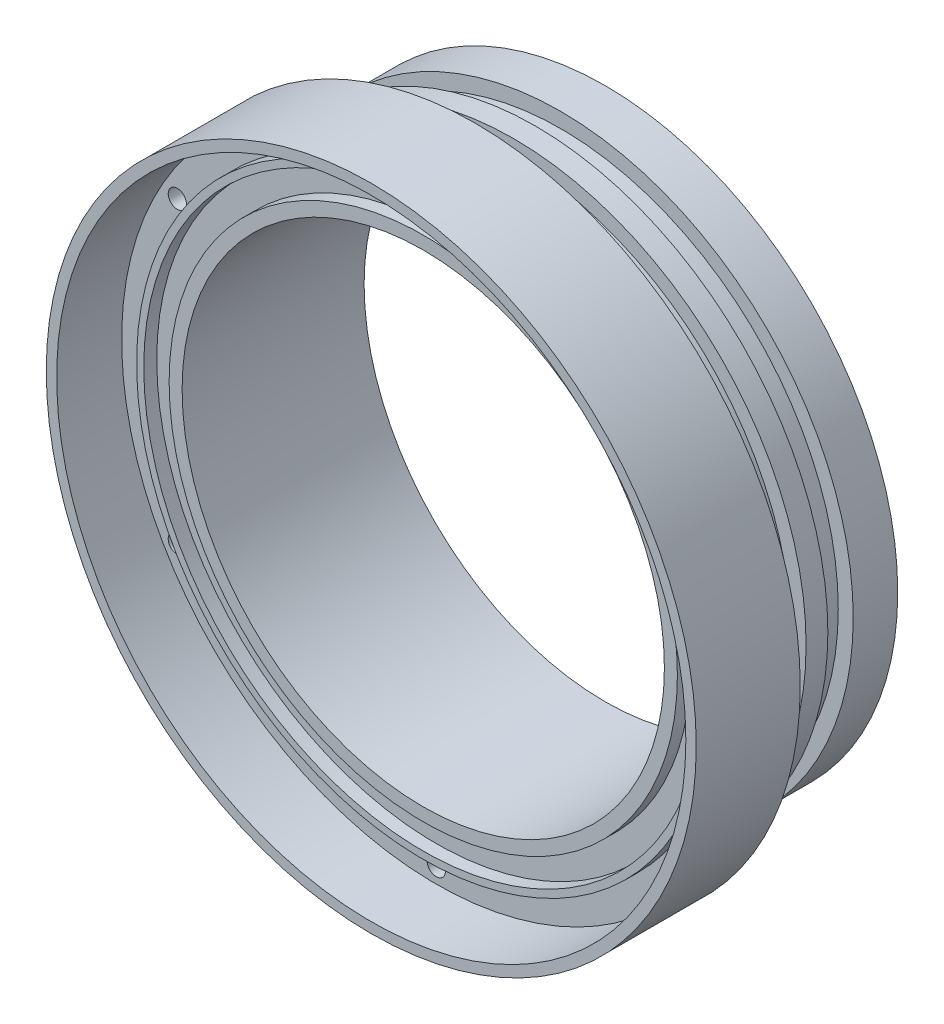
ISO-10303-21;
HEADER;
FILE_DESCRIPTION(('STEP AP214'),'2;1');
FILE_NAME('part.step','',(''),(''),'','','');
FILE_SCHEMA(('AUTOMOTIVE_DESIGN { 1 0 10303 214 1 1 1 1 }'));
ENDSEC;
DATA;
#1=APPLICATION_CONTEXT('core data for automotive mechanical design processes');
#2=APPLICATION_PROTOCOL_DEFINITION('international standard','automotive_design',2000,#1);
#3=PRODUCT_CONTEXT('',#1,'mechanical');
#4=PRODUCT('Part','Part','',(#3));
#5=PRODUCT_RELATED_PRODUCT_CATEGORY('part','',(#4));
#6=PRODUCT_DEFINITION_FORMATION('','',#4);
#7=PRODUCT_DEFINITION_CONTEXT('part definition',#1,'design');
#8=PRODUCT_DEFINITION('design','',#6,#7);
#9=PRODUCT_DEFINITION_SHAPE('','',#8);
#10=(LENGTH_UNIT() NAMED_UNIT(*) SI_UNIT(.MILLI.,.METRE.));
#11=(NAMED_UNIT(*) PLANE_ANGLE_UNIT() SI_UNIT($,.RADIAN.));
#12=(NAMED_UNIT(*) SI_UNIT($,.STERADIAN.) SOLID_ANGLE_UNIT());
#13=UNCERTAINTY_MEASURE_WITH_UNIT(LENGTH_MEASURE(1.E-05),#10,'distance_accuracy_value','');
#14=(GEOMETRIC_REPRESENTATION_CONTEXT(3) GLOBAL_UNCERTAINTY_ASSIGNED_CONTEXT((#13)) GLOBAL_UNIT_ASSIGNED_CONTEXT((#10,
#11,#12)) REPRESENTATION_CONTEXT('',''));
#15=CARTESIAN_POINT('',(0.,0.,0.));
#16=DIRECTION('',(0.,0.,1.));
#17=DIRECTION('',(1.,0.,0.));
#18=AXIS2_PLACEMENT_3D('',#15,#16,#17);
#19=CARTESIAN_POINT('',(0.,0.,-8.));
#20=DIRECTION('',(0.,0.,-1.));
#21=DIRECTION('',(-1.,0.,0.));
#22=AXIS2_PLACEMENT_3D('',#19,#20,#21);
#23=CYLINDRICAL_SURFACE('',#22,45.);
#24=CARTESIAN_POINT('',(0.,0.,-8.));
#25=DIRECTION('',(0.,0.,-1.));
#26=DIRECTION('',(-1.,0.,0.));
#27=AXIS2_PLACEMENT_3D('',#24,#25,#26);
#28=CIRCLE('',#27,45.);
#29=CARTESIAN_POINT('',(-45.,0.,-8.));
#30=VERTEX_POINT('',#29);
#31=EDGE_CURVE('E77',#30,#30,#28,.T.);
#32=ORIENTED_EDGE('',*,*,#31,.T.);
#33=EDGE_LOOP('',(#32));
#34=FACE_BOUND('',#33,.T.);
#35=CARTESIAN_POINT('',(0.,0.,-10.));
#36=DIRECTION('',(0.,0.,1.));
#37=DIRECTION('',(1.,0.,0.));
#38=AXIS2_PLACEMENT_3D('',#35,#36,#37);
#39=CIRCLE('',#38,45.);
#40=CARTESIAN_POINT('',(45.,0.,-10.));
#41=VERTEX_POINT('',#40);
#42=EDGE_CURVE('E156',#41,#41,#39,.T.);
#43=ORIENTED_EDGE('',*,*,#42,.T.);
#44=EDGE_LOOP('',(#43));
#45=FACE_BOUND('',#44,.T.);
#46=ADVANCED_FACE('F69',(#34,#45),#23,.T.);
#47=CARTESIAN_POINT('',(0.,0.,0.));
#48=DIRECTION('',(0.,0.,1.));
#49=DIRECTION('',(1.,0.,0.));
#50=AXIS2_PLACEMENT_3D('',#47,#48,#49);
#51=PLANE('',#50);
#52=CARTESIAN_POINT('',(0.,0.,0.));
#53=DIRECTION('',(0.,0.,1.));
#54=DIRECTION('',(1.,0.,0.));
#55=AXIS2_PLACEMENT_3D('',#52,#53,#54);
#56=CIRCLE('',#55,43.);
#57=CARTESIAN_POINT('',(43.,0.,0.));
#58=VERTEX_POINT('',#57);
#59=EDGE_CURVE('E93',#58,#58,#56,.T.);
#60=ORIENTED_EDGE('',*,*,#59,.F.);
#61=EDGE_LOOP('',(#60));
#62=FACE_BOUND('',#61,.T.);
#63=CARTESIAN_POINT('',(0.,0.,0.));
#64=DIRECTION('',(0.,0.,1.));
#65=DIRECTION('',(1.,0.,0.));
#66=AXIS2_PLACEMENT_3D('',#63,#64,#65);
#67=CIRCLE('',#66,44.1);
#68=CARTESIAN_POINT('',(44.1,0.,0.));
#69=VERTEX_POINT('',#68);
#70=EDGE_CURVE('E143',#69,#69,#67,.T.);
#71=ORIENTED_EDGE('',*,*,#70,.T.);
#72=EDGE_LOOP('',(#71));
#73=FACE_BOUND('',#72,.T.);
#74=ADVANCED_FACE('F239',(#62,#73),#51,.T.);
#75=CARTESIAN_POINT('',(0.,0.,0.));
#76=DIRECTION('',(0.,0.,1.));
#77=DIRECTION('',(1.,0.,0.));
#78=AXIS2_PLACEMENT_3D('',#75,#76,#77);
#79=CIRCLE('',#78,37.1);
#80=CARTESIAN_POINT('',(37.1,0.,0.));
#81=VERTEX_POINT('',#80);
#82=EDGE_CURVE('E85',#81,#81,#79,.T.);
#83=ORIENTED_EDGE('',*,*,#82,.F.);
#84=EDGE_LOOP('',(#83));
#85=FACE_BOUND('',#84,.T.);
#86=CARTESIAN_POINT('',(0.,0.,0.));
#87=DIRECTION('',(0.,0.,1.));
#88=DIRECTION('',(1.,0.,0.));
#89=AXIS2_PLACEMENT_3D('',#86,#87,#88);
#90=CIRCLE('',#89,39.1);
#91=CARTESIAN_POINT('',(39.1,0.,0.));
#92=VERTEX_POINT('',#91);
#93=EDGE_CURVE('E97',#92,#92,#90,.T.);
#94=ORIENTED_EDGE('',*,*,#93,.T.);
#95=EDGE_LOOP('',(#94));
#96=FACE_BOUND('',#95,.T.);
#97=ADVANCED_FACE('F351',(#85,#96),#51,.T.);
#98=CARTESIAN_POINT('',(0.,0.,-28.));
#99=DIRECTION('',(0.,0.,1.));
#100=DIRECTION('',(1.,0.,0.));
#101=AXIS2_PLACEMENT_3D('',#98,#99,#100);
#102=CYLINDRICAL_SURFACE('',#101,50.);
#103=CARTESIAN_POINT('',(0.,0.,-8.));
#104=DIRECTION('',(0.,0.,-1.));
#105=DIRECTION('',(-1.,0.,0.));
#106=AXIS2_PLACEMENT_3D('',#103,#104,#105);
#107=CIRCLE('',#106,50.);
#108=CARTESIAN_POINT('',(-50.,0.,-8.));
#109=VERTEX_POINT('',#108);
#110=EDGE_CURVE('E11',#109,#109,#107,.F.);
#111=ORIENTED_EDGE('',*,*,#110,.T.);
#112=EDGE_LOOP('',(#111));
#113=FACE_BOUND('',#112,.T.);
#114=CARTESIAN_POINT('',(0.,0.,8.));
#115=DIRECTION('',(0.,0.,1.));
#116=DIRECTION('',(1.,0.,0.));
#117=AXIS2_PLACEMENT_3D('',#114,#115,#116);
#118=CIRCLE('',#117,50.);
#119=CARTESIAN_POINT('',(50.,0.,8.));
#120=VERTEX_POINT('',#119);
#121=EDGE_CURVE('E120',#120,#120,#118,.T.);
#122=ORIENTED_EDGE('',*,*,#121,.F.);
#123=EDGE_LOOP('',(#122));
#124=FACE_BOUND('',#123,.T.);
#125=ADVANCED_FACE('F71',(#113,#124),#102,.T.);
#126=CARTESIAN_POINT('',(0.,0.,-8.));
#127=DIRECTION('',(0.,0.,-1.));
#128=DIRECTION('',(-1.,0.,0.));
#129=AXIS2_PLACEMENT_3D('',#126,#127,#128);
#130=PLANE('',#129);
#131=ORIENTED_EDGE('',*,*,#110,.F.);
#132=EDGE_LOOP('',(#131));
#133=FACE_BOUND('',#132,.T.);
#134=ORIENTED_EDGE('',*,*,#31,.F.);
#135=EDGE_LOOP('',(#134));
#136=FACE_BOUND('',#135,.T.);
#137=ADVANCED_FACE('F227',(#133,#136),#130,.T.);
#138=CARTESIAN_POINT('',(0.,0.,-21.1513502806122));
#139=DIRECTION('',(0.,0.,1.));
#140=DIRECTION('',(1.,0.,0.));
#141=AXIS2_PLACEMENT_3D('',#138,#139,#140);
#142=CIRCLE('',#141,45.);
#143=CARTESIAN_POINT('',(45.,0.,-21.1513502806122));
#144=VERTEX_POINT('',#143);
#145=EDGE_CURVE('E160',#144,#144,#142,.T.);
#146=ORIENTED_EDGE('',*,*,#145,.F.);
#147=EDGE_LOOP('',(#146));
#148=FACE_BOUND('',#147,.T.);
#149=CARTESIAN_POINT('',(0.,0.,-28.));
#150=DIRECTION('',(0.,0.,-1.));
#151=DIRECTION('',(-1.,0.,0.));
#152=AXIS2_PLACEMENT_3D('',#149,#150,#151);
#153=CIRCLE('',#152,45.);
#154=CARTESIAN_POINT('',(-45.,0.,-28.));
#155=VERTEX_POINT('',#154);
#156=EDGE_CURVE('E81',#155,#155,#153,.T.);
#157=ORIENTED_EDGE('',*,*,#156,.F.);
#158=EDGE_LOOP('',(#157));
#159=FACE_BOUND('',#158,.T.);
#160=ADVANCED_FACE('F214',(#148,#159),#23,.T.);
#161=CARTESIAN_POINT('',(0.,0.,-28.));
#162=DIRECTION('',(0.,0.,1.));
#163=DIRECTION('',(1.,0.,0.));
#164=AXIS2_PLACEMENT_3D('',#161,#162,#163);
#165=PLANE('',#164);
#166=CARTESIAN_POINT('',(0.,40.8747226668168,-28.));
#167=DIRECTION('',(0.,0.,-1.));
#168=DIRECTION('',(-1.,0.,0.));
#169=AXIS2_PLACEMENT_3D('',#166,#167,#168);
#170=CIRCLE('',#169,1.35630320483185);
#171=CARTESIAN_POINT('',(-1.35630320483185,40.8747226668168,-28.));
#172=VERTEX_POINT('',#171);
#173=EDGE_CURVE('E195',#172,#172,#170,.T.);
#174=ORIENTED_EDGE('',*,*,#173,.F.);
#175=EDGE_LOOP('',(#174));
#176=FACE_BOUND('',#175,.T.);
#177=CARTESIAN_POINT('',(-40.8747226668179,1.15672378085662E-12,-28.));
#178=DIRECTION('',(0.,0.,-1.));
#179=DIRECTION('',(-1.,0.,0.));
#180=AXIS2_PLACEMENT_3D('',#177,#178,#179);
#181=CIRCLE('',#180,1.35630320483275);
#182=CARTESIAN_POINT('',(-42.2310258716507,1.15672378085662E-12,-28.));
#183=VERTEX_POINT('',#182);
#184=EDGE_CURVE('E189',#183,#183,#181,.T.);
#185=ORIENTED_EDGE('',*,*,#184,.F.);
#186=EDGE_LOOP('',(#185));
#187=FACE_BOUND('',#186,.T.);
#188=CARTESIAN_POINT('',(-2.31344756171324E-12,-40.8747226668168,-28.));
#189=DIRECTION('',(0.,0.,-1.));
#190=DIRECTION('',(-1.,0.,0.));
#191=AXIS2_PLACEMENT_3D('',#188,#189,#190);
#192=CIRCLE('',#191,1.35630320483434);
#193=CARTESIAN_POINT('',(-1.35630320483665,-40.8747226668168,-28.));
#194=VERTEX_POINT('',#193);
#195=EDGE_CURVE('E183',#194,#194,#192,.T.);
#196=ORIENTED_EDGE('',*,*,#195,.F.);
#197=EDGE_LOOP('',(#196));
#198=FACE_BOUND('',#197,.T.);
#199=CARTESIAN_POINT('',(40.8747226668156,-1.16172949068461E-12,-28.));
#200=DIRECTION('',(0.,0.,-1.));
#201=DIRECTION('',(-1.,0.,0.));
#202=AXIS2_PLACEMENT_3D('',#199,#200,#201);
#203=CIRCLE('',#202,1.35630320483371);
#204=CARTESIAN_POINT('',(39.5184194619819,-1.16172949068461E-12,-28.));
#205=VERTEX_POINT('',#204);
#206=EDGE_CURVE('E177',#205,#205,#203,.T.);
#207=ORIENTED_EDGE('',*,*,#206,.F.);
#208=EDGE_LOOP('',(#207));
#209=FACE_BOUND('',#208,.T.);
#210=CARTESIAN_POINT('',(0.,0.,-28.));
#211=DIRECTION('',(0.,0.,-1.));
#212=DIRECTION('',(-1.,0.,0.));
#213=AXIS2_PLACEMENT_3D('',#210,#211,#212);
#214=CIRCLE('',#213,37.1);
#215=CARTESIAN_POINT('',(-37.1,0.,-28.));
#216=VERTEX_POINT('',#215);
#217=EDGE_CURVE('E89',#216,#216,#214,.T.);
#218=ORIENTED_EDGE('',*,*,#217,.F.);
#219=EDGE_LOOP('',(#218));
#220=FACE_BOUND('',#219,.T.);
#221=ORIENTED_EDGE('',*,*,#156,.T.);
#222=EDGE_LOOP('',(#221));
#223=FACE_BOUND('',#222,.T.);
#224=ADVANCED_FACE('F210',(#176,#187,#198,#209,#220,#223),#165,.F.);
#225=CARTESIAN_POINT('',(0.,0.,18.3831416051891));
#226=DIRECTION('',(0.,0.,-1.));
#227=DIRECTION('',(-1.,0.,0.));
#228=AXIS2_PLACEMENT_3D('',#225,#226,#227);
#229=CYLINDRICAL_SURFACE('',#228,37.1);
#230=ORIENTED_EDGE('',*,*,#82,.T.);
#231=EDGE_LOOP('',(#230));
#232=FACE_BOUND('',#231,.T.);
#233=ORIENTED_EDGE('',*,*,#217,.T.);
#234=EDGE_LOOP('',(#233));
#235=FACE_BOUND('',#234,.T.);
#236=ADVANCED_FACE('F213',(#232,#235),#229,.F.);
#237=CARTESIAN_POINT('',(0.,0.,-2.));
#238=DIRECTION('',(0.,0.,1.));
#239=DIRECTION('',(1.,0.,0.));
#240=AXIS2_PLACEMENT_3D('',#237,#238,#239);
#241=CYLINDRICAL_SURFACE('',#240,39.1);
#242=CARTESIAN_POINT('',(0.,0.,-2.));
#243=DIRECTION('',(0.,0.,1.));
#244=DIRECTION('',(1.,0.,0.));
#245=AXIS2_PLACEMENT_3D('',#242,#243,#244);
#246=CIRCLE('',#245,39.1);
#247=CARTESIAN_POINT('',(39.1,0.,-2.));
#248=VERTEX_POINT('',#247);
#249=EDGE_CURVE('E96',#248,#248,#246,.T.);
#250=ORIENTED_EDGE('',*,*,#249,.T.);
#251=EDGE_LOOP('',(#250));
#252=FACE_BOUND('',#251,.T.);
#253=ORIENTED_EDGE('',*,*,#93,.F.);
#254=EDGE_LOOP('',(#253));
#255=FACE_BOUND('',#254,.T.);
#256=ADVANCED_FACE('F340',(#252,#255),#241,.T.);
#257=CARTESIAN_POINT('',(0.,0.,-2.));
#258=DIRECTION('',(0.,0.,1.));
#259=DIRECTION('',(1.,0.,0.));
#260=AXIS2_PLACEMENT_3D('',#257,#258,#259);
#261=CYLINDRICAL_SURFACE('',#260,43.);
#262=CARTESIAN_POINT('',(0.,0.,-2.));
#263=DIRECTION('',(0.,0.,1.));
#264=DIRECTION('',(1.,0.,0.));
#265=AXIS2_PLACEMENT_3D('',#262,#263,#264);
#266=CIRCLE('',#265,43.);
#267=CARTESIAN_POINT('',(43.,0.,-2.));
#268=VERTEX_POINT('',#267);
#269=EDGE_CURVE('E92',#268,#268,#266,.T.);
#270=ORIENTED_EDGE('',*,*,#269,.F.);
#271=EDGE_LOOP('',(#270));
#272=FACE_BOUND('',#271,.T.);
#273=ORIENTED_EDGE('',*,*,#59,.T.);
#274=EDGE_LOOP('',(#273));
#275=FACE_BOUND('',#274,.T.);
#276=ADVANCED_FACE('F336',(#272,#275),#261,.F.);
#277=CARTESIAN_POINT('',(0.,0.,-2.));
#278=DIRECTION('',(0.,0.,1.));
#279=DIRECTION('',(1.,0.,0.));
#280=AXIS2_PLACEMENT_3D('',#277,#278,#279);
#281=PLANE('',#280);
#282=ORIENTED_EDGE('',*,*,#249,.F.);
#283=EDGE_LOOP('',(#282));
#284=FACE_BOUND('',#283,.T.);
#285=ORIENTED_EDGE('',*,*,#269,.T.);
#286=EDGE_LOOP('',(#285));
#287=FACE_BOUND('',#286,.T.);
#288=ADVANCED_FACE('F290',(#284,#287),#281,.T.);
#289=CARTESIAN_POINT('',(0.,0.,8.));
#290=DIRECTION('',(0.,0.,1.));
#291=DIRECTION('',(1.,0.,0.));
#292=AXIS2_PLACEMENT_3D('',#289,#290,#291);
#293=PLANE('',#292);
#294=ORIENTED_EDGE('',*,*,#121,.T.);
#295=EDGE_LOOP('',(#294));
#296=FACE_BOUND('',#295,.T.);
#297=CARTESIAN_POINT('',(0.,0.,8.));
#298=DIRECTION('',(0.,0.,1.));
#299=DIRECTION('',(1.,0.,0.));
#300=AXIS2_PLACEMENT_3D('',#297,#298,#299);
#301=CIRCLE('',#300,48.4);
#302=CARTESIAN_POINT('',(48.4,0.,8.));
#303=VERTEX_POINT('',#302);
#304=EDGE_CURVE('E125',#303,#303,#301,.T.);
#305=ORIENTED_EDGE('',*,*,#304,.F.);
#306=EDGE_LOOP('',(#305));
#307=FACE_BOUND('',#306,.T.);
#308=ADVANCED_FACE('F286',(#296,#307),#293,.T.);
#309=CARTESIAN_POINT('',(0.,0.,8.));
#310=DIRECTION('',(0.,0.,-1.));
#311=DIRECTION('',(-1.,0.,0.));
#312=AXIS2_PLACEMENT_3D('',#309,#310,#311);
#313=CYLINDRICAL_SURFACE('',#312,48.4);
#314=ORIENTED_EDGE('',*,*,#304,.T.);
#315=EDGE_LOOP('',(#314));
#316=FACE_BOUND('',#315,.T.);
#317=CARTESIAN_POINT('',(0.,0.,-2.));
#318=DIRECTION('',(0.,0.,1.));
#319=DIRECTION('',(1.,0.,0.));
#320=AXIS2_PLACEMENT_3D('',#317,#318,#319);
#321=CIRCLE('',#320,48.4);
#322=CARTESIAN_POINT('',(48.4,0.,-2.));
#323=VERTEX_POINT('',#322);
#324=EDGE_CURVE('E148',#323,#323,#321,.T.);
#325=ORIENTED_EDGE('',*,*,#324,.F.);
#326=EDGE_LOOP('',(#325));
#327=FACE_BOUND('',#326,.T.);
#328=ADVANCED_FACE('F278',(#316,#327),#313,.F.);
#329=CARTESIAN_POINT('',(0.,0.,-2.));
#330=DIRECTION('',(0.,0.,1.));
#331=DIRECTION('',(1.,0.,0.));
#332=AXIS2_PLACEMENT_3D('',#329,#330,#331);
#333=PLANE('',#332);
#334=CARTESIAN_POINT('',(0.,0.,-2.));
#335=DIRECTION('',(0.,0.,1.));
#336=DIRECTION('',(1.,0.,0.));
#337=AXIS2_PLACEMENT_3D('',#334,#335,#336);
#338=CIRCLE('',#337,44.1);
#339=CARTESIAN_POINT('',(44.1,0.,-2.));
#340=VERTEX_POINT('',#339);
#341=EDGE_CURVE('E146',#340,#340,#338,.T.);
#342=ORIENTED_EDGE('',*,*,#341,.F.);
#343=EDGE_LOOP('',(#342));
#344=FACE_BOUND('',#343,.T.);
#345=ORIENTED_EDGE('',*,*,#324,.T.);
#346=EDGE_LOOP('',(#345));
#347=FACE_BOUND('',#346,.T.);
#348=CARTESIAN_POINT('',(0.,46.,-2.));
#349=DIRECTION('',(0.,0.,1.));
#350=DIRECTION('',(1.,0.,0.));
#351=AXIS2_PLACEMENT_3D('',#348,#349,#350);
#352=CIRCLE('',#351,1.40000000000463);
#353=CARTESIAN_POINT('',(1.40000000000463,46.,-2.));
#354=VERTEX_POINT('',#353);
#355=EDGE_CURVE('E73',#354,#354,#352,.F.);
#356=ORIENTED_EDGE('',*,*,#355,.T.);
#357=EDGE_LOOP('',(#356));
#358=FACE_BOUND('',#357,.T.);
#359=CARTESIAN_POINT('',(-39.8371685740822,22.9999999999981,-2.));
#360=DIRECTION('',(0.,0.,1.));
#361=DIRECTION('',(1.,0.,0.));
#362=AXIS2_PLACEMENT_3D('',#359,#360,#361);
#363=CIRCLE('',#362,1.40000000000463);
#364=CARTESIAN_POINT('',(-38.4371685740775,22.9999999999981,-2.));
#365=VERTEX_POINT('',#364);
#366=EDGE_CURVE('E140',#365,#365,#363,.F.);
#367=ORIENTED_EDGE('',*,*,#366,.T.);
#368=EDGE_LOOP('',(#367));
#369=FACE_BOUND('',#368,.T.);
#370=CARTESIAN_POINT('',(-39.8371685740795,-23.0000000000011,-2.));
#371=DIRECTION('',(0.,0.,1.));
#372=DIRECTION('',(1.,0.,0.));
#373=AXIS2_PLACEMENT_3D('',#370,#371,#372);
#374=CIRCLE('',#373,1.40000000000462);
#375=CARTESIAN_POINT('',(-38.4371685740749,-23.0000000000011,-2.));
#376=VERTEX_POINT('',#375);
#377=EDGE_CURVE('E137',#376,#376,#374,.F.);
#378=ORIENTED_EDGE('',*,*,#377,.T.);
#379=EDGE_LOOP('',(#378));
#380=FACE_BOUND('',#379,.T.);
#381=CARTESIAN_POINT('',(5.30651911301305E-12,-45.9999999999984,-2.));
#382=DIRECTION('',(0.,0.,1.));
#383=DIRECTION('',(1.,0.,0.));
#384=AXIS2_PLACEMENT_3D('',#381,#382,#383);
#385=CIRCLE('',#384,1.40000000000463);
#386=CARTESIAN_POINT('',(1.40000000000994,-45.9999999999984,-2.));
#387=VERTEX_POINT('',#386);
#388=EDGE_CURVE('E134',#387,#387,#385,.F.);
#389=ORIENTED_EDGE('',*,*,#388,.T.);
#390=EDGE_LOOP('',(#389));
#391=FACE_BOUND('',#390,.T.);
#392=CARTESIAN_POINT('',(39.8371685740874,-22.9999999999965,-2.));
#393=DIRECTION('',(0.,0.,1.));
#394=DIRECTION('',(1.,0.,0.));
#395=AXIS2_PLACEMENT_3D('',#392,#393,#394);
#396=CIRCLE('',#395,1.40000000000463);
#397=CARTESIAN_POINT('',(41.2371685740921,-22.9999999999965,-2.));
#398=VERTEX_POINT('',#397);
#399=EDGE_CURVE('E131',#398,#398,#396,.F.);
#400=ORIENTED_EDGE('',*,*,#399,.T.);
#401=EDGE_LOOP('',(#400));
#402=FACE_BOUND('',#401,.T.);
#403=CARTESIAN_POINT('',(39.8371685740848,23.0000000000027,-2.));
#404=DIRECTION('',(0.,0.,1.));
#405=DIRECTION('',(1.,0.,0.));
#406=AXIS2_PLACEMENT_3D('',#403,#404,#405);
#407=CIRCLE('',#406,1.40000000000462);
#408=CARTESIAN_POINT('',(41.2371685740894,23.0000000000027,-2.));
#409=VERTEX_POINT('',#408);
#410=EDGE_CURVE('E128',#409,#409,#407,.F.);
#411=ORIENTED_EDGE('',*,*,#410,.T.);
#412=EDGE_LOOP('',(#411));
#413=FACE_BOUND('',#412,.T.);
#414=ADVANCED_FACE('F274',(#344,#347,#358,#369,#380,#391,#402,#413),#333,.T.);
#415=CARTESIAN_POINT('',(0.,0.,-2.));
#416=DIRECTION('',(0.,0.,1.));
#417=DIRECTION('',(1.,0.,0.));
#418=AXIS2_PLACEMENT_3D('',#415,#416,#417);
#419=CYLINDRICAL_SURFACE('',#418,44.1);
#420=ORIENTED_EDGE('',*,*,#70,.F.);
#421=EDGE_LOOP('',(#420));
#422=FACE_BOUND('',#421,.T.);
#423=ORIENTED_EDGE('',*,*,#341,.T.);
#424=EDGE_LOOP('',(#423));
#425=FACE_BOUND('',#424,.T.);
#426=ADVANCED_FACE('F277',(#422,#425),#419,.T.);
#427=CARTESIAN_POINT('',(0.,0.,-7.));
#428=DIRECTION('',(0.,0.,1.));
#429=DIRECTION('',(1.,0.,0.));
#430=AXIS2_PLACEMENT_3D('',#427,#428,#429);
#431=PLANE('',#430);
#432=CARTESIAN_POINT('',(0.,46.,-7.));
#433=DIRECTION('',(0.,0.,1.));
#434=DIRECTION('',(1.,0.,0.));
#435=AXIS2_PLACEMENT_3D('',#432,#433,#434);
#436=CIRCLE('',#435,1.40000000000463);
#437=CARTESIAN_POINT('',(1.40000000000463,46.,-7.));
#438=VERTEX_POINT('',#437);
#439=EDGE_CURVE('E100',#438,#438,#436,.T.);
#440=ORIENTED_EDGE('',*,*,#439,.T.);
#441=EDGE_LOOP('',(#440));
#442=FACE_BOUND('',#441,.T.);
#443=ADVANCED_FACE('F282',(#442),#431,.T.);
#444=CARTESIAN_POINT('',(0.,46.,-7.));
#445=DIRECTION('',(0.,0.,1.));
#446=DIRECTION('',(1.,0.,0.));
#447=AXIS2_PLACEMENT_3D('',#444,#445,#446);
#448=CYLINDRICAL_SURFACE('',#447,1.40000000000463);
#449=ORIENTED_EDGE('',*,*,#439,.F.);
#450=EDGE_LOOP('',(#449));
#451=FACE_BOUND('',#450,.T.);
#452=ORIENTED_EDGE('',*,*,#355,.F.);
#453=EDGE_LOOP('',(#452));
#454=FACE_BOUND('',#453,.T.);
#455=ADVANCED_FACE('F294',(#451,#454),#448,.F.);
#456=CARTESIAN_POINT('',(0.,0.,-7.));
#457=DIRECTION('',(0.,0.,1.));
#458=DIRECTION('',(1.,0.,0.));
#459=AXIS2_PLACEMENT_3D('',#456,#457,#458);
#460=PLANE('',#459);
#461=CARTESIAN_POINT('',(-39.8371685740822,22.9999999999981,-7.));
#462=DIRECTION('',(0.,0.,1.));
#463=DIRECTION('',(1.,0.,0.));
#464=AXIS2_PLACEMENT_3D('',#461,#462,#463);
#465=CIRCLE('',#464,1.40000000000463);
#466=CARTESIAN_POINT('',(-38.4371685740775,22.9999999999981,-7.));
#467=VERTEX_POINT('',#466);
#468=EDGE_CURVE('E109',#467,#467,#465,.T.);
#469=ORIENTED_EDGE('',*,*,#468,.T.);
#470=EDGE_LOOP('',(#469));
#471=FACE_BOUND('',#470,.T.);
#472=ADVANCED_FACE('F298',(#471),#460,.T.);
#473=CARTESIAN_POINT('',(-39.8371685740822,22.9999999999981,-7.));
#474=DIRECTION('',(0.,0.,1.));
#475=DIRECTION('',(1.,0.,0.));
#476=AXIS2_PLACEMENT_3D('',#473,#474,#475);
#477=CYLINDRICAL_SURFACE('',#476,1.40000000000463);
#478=ORIENTED_EDGE('',*,*,#468,.F.);
#479=EDGE_LOOP('',(#478));
#480=FACE_BOUND('',#479,.T.);
#481=ORIENTED_EDGE('',*,*,#366,.F.);
#482=EDGE_LOOP('',(#481));
#483=FACE_BOUND('',#482,.T.);
#484=ADVANCED_FACE('F302',(#480,#483),#477,.F.);
#485=CARTESIAN_POINT('',(0.,0.,-7.));
#486=DIRECTION('',(0.,0.,1.));
#487=DIRECTION('',(1.,0.,0.));
#488=AXIS2_PLACEMENT_3D('',#485,#486,#487);
#489=PLANE('',#488);
#490=CARTESIAN_POINT('',(-39.8371685740795,-23.0000000000011,-7.));
#491=DIRECTION('',(0.,0.,1.));
#492=DIRECTION('',(1.,0.,0.));
#493=AXIS2_PLACEMENT_3D('',#490,#491,#492);
#494=CIRCLE('',#493,1.40000000000462);
#495=CARTESIAN_POINT('',(-38.4371685740749,-23.0000000000011,-7.));
#496=VERTEX_POINT('',#495);
#497=EDGE_CURVE('E105',#496,#496,#494,.T.);
#498=ORIENTED_EDGE('',*,*,#497,.T.);
#499=EDGE_LOOP('',(#498));
#500=FACE_BOUND('',#499,.T.);
#501=ADVANCED_FACE('F306',(#500),#489,.T.);
#502=CARTESIAN_POINT('',(-39.8371685740795,-23.0000000000011,-7.));
#503=DIRECTION('',(0.,0.,1.));
#504=DIRECTION('',(1.,0.,0.));
#505=AXIS2_PLACEMENT_3D('',#502,#503,#504);
#506=CYLINDRICAL_SURFACE('',#505,1.40000000000462);
#507=ORIENTED_EDGE('',*,*,#497,.F.);
#508=EDGE_LOOP('',(#507));
#509=FACE_BOUND('',#508,.T.);
#510=ORIENTED_EDGE('',*,*,#377,.F.);
#511=EDGE_LOOP('',(#510));
#512=FACE_BOUND('',#511,.T.);
#513=ADVANCED_FACE('F323',(#509,#512),#506,.F.);
#514=CARTESIAN_POINT('',(0.,0.,-7.));
#515=DIRECTION('',(0.,0.,1.));
#516=DIRECTION('',(1.,0.,0.));
#517=AXIS2_PLACEMENT_3D('',#514,#515,#516);
#518=PLANE('',#517);
#519=CARTESIAN_POINT('',(5.30651911301305E-12,-45.9999999999984,-7.));
#520=DIRECTION('',(0.,0.,1.));
#521=DIRECTION('',(1.,0.,0.));
#522=AXIS2_PLACEMENT_3D('',#519,#520,#521);
#523=CIRCLE('',#522,1.40000000000463);
#524=CARTESIAN_POINT('',(1.40000000000994,-45.9999999999984,-7.));
#525=VERTEX_POINT('',#524);
#526=EDGE_CURVE('E108',#525,#525,#523,.T.);
#527=ORIENTED_EDGE('',*,*,#526,.T.);
#528=EDGE_LOOP('',(#527));
#529=FACE_BOUND('',#528,.T.);
#530=ADVANCED_FACE('F320',(#529),#518,.T.);
#531=CARTESIAN_POINT('',(5.30651911301305E-12,-45.9999999999984,-7.));
#532=DIRECTION('',(0.,0.,1.));
#533=DIRECTION('',(1.,0.,0.));
#534=AXIS2_PLACEMENT_3D('',#531,#532,#533);
#535=CYLINDRICAL_SURFACE('',#534,1.40000000000463);
#536=ORIENTED_EDGE('',*,*,#526,.F.);
#537=EDGE_LOOP('',(#536));
#538=FACE_BOUND('',#537,.T.);
#539=ORIENTED_EDGE('',*,*,#388,.F.);
#540=EDGE_LOOP('',(#539));
#541=FACE_BOUND('',#540,.T.);
#542=ADVANCED_FACE('F315',(#538,#541),#535,.F.);
#543=CARTESIAN_POINT('',(0.,0.,-7.));
#544=DIRECTION('',(0.,0.,1.));
#545=DIRECTION('',(1.,0.,0.));
#546=AXIS2_PLACEMENT_3D('',#543,#544,#545);
#547=PLANE('',#546);
#548=CARTESIAN_POINT('',(39.8371685740874,-22.9999999999965,-7.));
#549=DIRECTION('',(0.,0.,1.));
#550=DIRECTION('',(1.,0.,0.));
#551=AXIS2_PLACEMENT_3D('',#548,#549,#550);
#552=CIRCLE('',#551,1.40000000000463);
#553=CARTESIAN_POINT('',(41.2371685740921,-22.9999999999965,-7.));
#554=VERTEX_POINT('',#553);
#555=EDGE_CURVE('E112',#554,#554,#552,.T.);
#556=ORIENTED_EDGE('',*,*,#555,.T.);
#557=EDGE_LOOP('',(#556));
#558=FACE_BOUND('',#557,.T.);
#559=ADVANCED_FACE('F312',(#558),#547,.T.);
#560=CARTESIAN_POINT('',(39.8371685740874,-22.9999999999965,-7.));
#561=DIRECTION('',(0.,0.,1.));
#562=DIRECTION('',(1.,0.,0.));
#563=AXIS2_PLACEMENT_3D('',#560,#561,#562);
#564=CYLINDRICAL_SURFACE('',#563,1.40000000000463);
#565=ORIENTED_EDGE('',*,*,#555,.F.);
#566=EDGE_LOOP('',(#565));
#567=FACE_BOUND('',#566,.T.);
#568=ORIENTED_EDGE('',*,*,#399,.F.);
#569=EDGE_LOOP('',(#568));
#570=FACE_BOUND('',#569,.T.);
#571=ADVANCED_FACE('F309',(#567,#570),#564,.F.);
#572=CARTESIAN_POINT('',(0.,0.,-7.));
#573=DIRECTION('',(0.,0.,1.));
#574=DIRECTION('',(1.,0.,0.));
#575=AXIS2_PLACEMENT_3D('',#572,#573,#574);
#576=PLANE('',#575);
#577=CARTESIAN_POINT('',(39.8371685740848,23.0000000000027,-7.));
#578=DIRECTION('',(0.,0.,1.));
#579=DIRECTION('',(1.,0.,0.));
#580=AXIS2_PLACEMENT_3D('',#577,#578,#579);
#581=CIRCLE('',#580,1.40000000000462);
#582=CARTESIAN_POINT('',(41.2371685740894,23.0000000000027,-7.));
#583=VERTEX_POINT('',#582);
#584=EDGE_CURVE('E115',#583,#583,#581,.T.);
#585=ORIENTED_EDGE('',*,*,#584,.T.);
#586=EDGE_LOOP('',(#585));
#587=FACE_BOUND('',#586,.T.);
#588=ADVANCED_FACE('F270',(#587),#576,.T.);
#589=CARTESIAN_POINT('',(39.8371685740848,23.0000000000027,-7.));
#590=DIRECTION('',(0.,0.,1.));
#591=DIRECTION('',(1.,0.,0.));
#592=AXIS2_PLACEMENT_3D('',#589,#590,#591);
#593=CYLINDRICAL_SURFACE('',#592,1.40000000000462);
#594=ORIENTED_EDGE('',*,*,#584,.F.);
#595=EDGE_LOOP('',(#594));
#596=FACE_BOUND('',#595,.T.);
#597=ORIENTED_EDGE('',*,*,#410,.F.);
#598=EDGE_LOOP('',(#597));
#599=FACE_BOUND('',#598,.T.);
#600=ADVANCED_FACE('F261',(#596,#599),#593,.F.);
#601=CARTESIAN_POINT('',(0.,0.,-17.2513502806122));
#602=DIRECTION('',(0.,0.,-1.));
#603=DIRECTION('',(-1.,0.,0.));
#604=AXIS2_PLACEMENT_3D('',#601,#602,#603);
#605=PLANE('',#604);
#606=CARTESIAN_POINT('',(0.,0.,-17.2513502806122));
#607=DIRECTION('',(0.,0.,1.));
#608=DIRECTION('',(1.,0.,0.));
#609=AXIS2_PLACEMENT_3D('',#606,#607,#608);
#610=CIRCLE('',#609,42.7);
#611=CARTESIAN_POINT('',(42.7,0.,-17.2513502806122));
#612=VERTEX_POINT('',#611);
#613=EDGE_CURVE('E153',#612,#612,#610,.T.);
#614=ORIENTED_EDGE('',*,*,#613,.T.);
#615=EDGE_LOOP('',(#614));
#616=FACE_BOUND('',#615,.T.);
#617=CARTESIAN_POINT('',(0.,0.,-17.2513502806122));
#618=DIRECTION('',(0.,0.,1.));
#619=DIRECTION('',(1.,0.,0.));
#620=AXIS2_PLACEMENT_3D('',#617,#618,#619);
#621=CIRCLE('',#620,45.);
#622=CARTESIAN_POINT('',(45.,0.,-17.2513502806122));
#623=VERTEX_POINT('',#622);
#624=EDGE_CURVE('E163',#623,#623,#621,.T.);
#625=ORIENTED_EDGE('',*,*,#624,.F.);
#626=EDGE_LOOP('',(#625));
#627=FACE_BOUND('',#626,.T.);
#628=ADVANCED_FACE('F259',(#616,#627),#605,.T.);
#629=CARTESIAN_POINT('',(0.,0.,0.));
#630=DIRECTION('',(0.,0.,1.));
#631=DIRECTION('',(1.,0.,0.));
#632=AXIS2_PLACEMENT_3D('',#629,#630,#631);
#633=CYLINDRICAL_SURFACE('',#632,42.7);
#634=CARTESIAN_POINT('',(0.,0.,-21.1513502806122));
#635=DIRECTION('',(0.,0.,1.));
#636=DIRECTION('',(1.,0.,0.));
#637=AXIS2_PLACEMENT_3D('',#634,#635,#636);
#638=CIRCLE('',#637,42.7);
#639=CARTESIAN_POINT('',(42.7,0.,-21.1513502806122));
#640=VERTEX_POINT('',#639);
#641=EDGE_CURVE('E157',#640,#640,#638,.T.);
#642=ORIENTED_EDGE('',*,*,#641,.T.);
#643=EDGE_LOOP('',(#642));
#644=FACE_BOUND('',#643,.T.);
#645=ORIENTED_EDGE('',*,*,#613,.F.);
#646=EDGE_LOOP('',(#645));
#647=FACE_BOUND('',#646,.T.);
#648=ADVANCED_FACE('F252',(#644,#647),#633,.T.);
#649=CARTESIAN_POINT('',(0.,0.,-21.1513502806122));
#650=DIRECTION('',(0.,0.,-1.));
#651=DIRECTION('',(-1.,0.,0.));
#652=AXIS2_PLACEMENT_3D('',#649,#650,#651);
#653=PLANE('',#652);
#654=ORIENTED_EDGE('',*,*,#641,.F.);
#655=EDGE_LOOP('',(#654));
#656=FACE_BOUND('',#655,.T.);
#657=ORIENTED_EDGE('',*,*,#145,.T.);
#658=EDGE_LOOP('',(#657));
#659=FACE_BOUND('',#658,.T.);
#660=ADVANCED_FACE('F243',(#656,#659),#653,.F.);
#661=CARTESIAN_POINT('',(0.,0.,-13.9));
#662=DIRECTION('',(0.,0.,1.));
#663=DIRECTION('',(1.,0.,0.));
#664=AXIS2_PLACEMENT_3D('',#661,#662,#663);
#665=CIRCLE('',#664,45.);
#666=CARTESIAN_POINT('',(45.,0.,-13.9));
#667=VERTEX_POINT('',#666);
#668=EDGE_CURVE('E172',#667,#667,#665,.T.);
#669=ORIENTED_EDGE('',*,*,#668,.F.);
#670=EDGE_LOOP('',(#669));
#671=FACE_BOUND('',#670,.T.);
#672=ORIENTED_EDGE('',*,*,#624,.T.);
#673=EDGE_LOOP('',(#672));
#674=FACE_BOUND('',#673,.T.);
#675=ADVANCED_FACE('F230',(#671,#674),#23,.T.);
#676=CARTESIAN_POINT('',(0.,0.,-10.));
#677=DIRECTION('',(0.,0.,-1.));
#678=DIRECTION('',(-1.,0.,0.));
#679=AXIS2_PLACEMENT_3D('',#676,#677,#678);
#680=PLANE('',#679);
#681=CARTESIAN_POINT('',(0.,0.,-10.));
#682=DIRECTION('',(0.,0.,1.));
#683=DIRECTION('',(1.,0.,0.));
#684=AXIS2_PLACEMENT_3D('',#681,#682,#683);
#685=CIRCLE('',#684,42.7);
#686=CARTESIAN_POINT('',(42.7,0.,-10.));
#687=VERTEX_POINT('',#686);
#688=EDGE_CURVE('E147',#687,#687,#685,.T.);
#689=ORIENTED_EDGE('',*,*,#688,.T.);
#690=EDGE_LOOP('',(#689));
#691=FACE_BOUND('',#690,.T.);
#692=ORIENTED_EDGE('',*,*,#42,.F.);
#693=EDGE_LOOP('',(#692));
#694=FACE_BOUND('',#693,.T.);
#695=ADVANCED_FACE('F242',(#691,#694),#680,.T.);
#696=CARTESIAN_POINT('',(0.,0.,0.));
#697=DIRECTION('',(0.,0.,1.));
#698=DIRECTION('',(1.,0.,0.));
#699=AXIS2_PLACEMENT_3D('',#696,#697,#698);
#700=CYLINDRICAL_SURFACE('',#699,42.7);
#701=CARTESIAN_POINT('',(0.,0.,-13.9));
#702=DIRECTION('',(0.,0.,1.));
#703=DIRECTION('',(1.,0.,0.));
#704=AXIS2_PLACEMENT_3D('',#701,#702,#703);
#705=CIRCLE('',#704,42.7);
#706=CARTESIAN_POINT('',(42.7,0.,-13.9));
#707=VERTEX_POINT('',#706);
#708=EDGE_CURVE('E169',#707,#707,#705,.T.);
#709=ORIENTED_EDGE('',*,*,#708,.T.);
#710=EDGE_LOOP('',(#709));
#711=FACE_BOUND('',#710,.T.);
#712=ORIENTED_EDGE('',*,*,#688,.F.);
#713=EDGE_LOOP('',(#712));
#714=FACE_BOUND('',#713,.T.);
#715=ADVANCED_FACE('F249',(#711,#714),#700,.T.);
#716=CARTESIAN_POINT('',(0.,0.,-13.9));
#717=DIRECTION('',(0.,0.,-1.));
#718=DIRECTION('',(-1.,0.,0.));
#719=AXIS2_PLACEMENT_3D('',#716,#717,#718);
#720=PLANE('',#719);
#721=ORIENTED_EDGE('',*,*,#708,.F.);
#722=EDGE_LOOP('',(#721));
#723=FACE_BOUND('',#722,.T.);
#724=ORIENTED_EDGE('',*,*,#668,.T.);
#725=EDGE_LOOP('',(#724));
#726=FACE_BOUND('',#725,.T.);
#727=ADVANCED_FACE('F443',(#723,#726),#720,.F.);
#728=CARTESIAN_POINT('',(40.8747226668156,-1.16172949068461E-12,-23.));
#729=DIRECTION('',(0.,0.,-1.));
#730=DIRECTION('',(-1.,0.,0.));
#731=AXIS2_PLACEMENT_3D('',#728,#729,#730);
#732=CYLINDRICAL_SURFACE('',#731,1.35630320483371);
#733=CARTESIAN_POINT('',(40.8747226668156,-1.16172949068461E-12,-23.));
#734=DIRECTION('',(0.,0.,-1.));
#735=DIRECTION('',(-1.,0.,0.));
#736=AXIS2_PLACEMENT_3D('',#733,#734,#735);
#737=CIRCLE('',#736,1.35630320483371);
#738=CARTESIAN_POINT('',(39.5184194619819,-1.16172949068461E-12,-23.));
#739=VERTEX_POINT('',#738);
#740=EDGE_CURVE('E180',#739,#739,#737,.T.);
#741=ORIENTED_EDGE('',*,*,#740,.F.);
#742=EDGE_LOOP('',(#741));
#743=FACE_BOUND('',#742,.T.);
#744=ORIENTED_EDGE('',*,*,#206,.T.);
#745=EDGE_LOOP('',(#744));
#746=FACE_BOUND('',#745,.T.);
#747=ADVANCED_FACE('F453',(#743,#746),#732,.F.);
#748=CARTESIAN_POINT('',(40.8747226668156,-1.16172949068461E-12,-23.));
#749=DIRECTION('',(0.,0.,-1.));
#750=DIRECTION('',(-1.,0.,0.));
#751=AXIS2_PLACEMENT_3D('',#748,#749,#750);
#752=PLANE('',#751);
#753=ORIENTED_EDGE('',*,*,#740,.T.);
#754=EDGE_LOOP('',(#753));
#755=FACE_BOUND('',#754,.T.);
#756=ADVANCED_FACE('F470',(#755),#752,.T.);
#757=CARTESIAN_POINT('',(-2.31344756171324E-12,-40.8747226668168,-23.));
#758=DIRECTION('',(0.,0.,-1.));
#759=DIRECTION('',(-1.,0.,0.));
#760=AXIS2_PLACEMENT_3D('',#757,#758,#759);
#761=CYLINDRICAL_SURFACE('',#760,1.35630320483434);
#762=CARTESIAN_POINT('',(-2.31344756171324E-12,-40.8747226668168,-23.));
#763=DIRECTION('',(0.,0.,-1.));
#764=DIRECTION('',(-1.,0.,0.));
#765=AXIS2_PLACEMENT_3D('',#762,#763,#764);
#766=CIRCLE('',#765,1.35630320483434);
#767=CARTESIAN_POINT('',(-1.35630320483665,-40.8747226668168,-23.));
#768=VERTEX_POINT('',#767);
#769=EDGE_CURVE('E186',#768,#768,#766,.T.);
#770=ORIENTED_EDGE('',*,*,#769,.F.);
#771=EDGE_LOOP('',(#770));
#772=FACE_BOUND('',#771,.T.);
#773=ORIENTED_EDGE('',*,*,#195,.T.);
#774=EDGE_LOOP('',(#773));
#775=FACE_BOUND('',#774,.T.);
#776=ADVANCED_FACE('F480',(#772,#775),#761,.F.);
#777=CARTESIAN_POINT('',(-2.31344756171324E-12,-40.8747226668168,-23.));
#778=DIRECTION('',(0.,0.,-1.));
#779=DIRECTION('',(-1.,0.,0.));
#780=AXIS2_PLACEMENT_3D('',#777,#778,#779);
#781=PLANE('',#780);
#782=ORIENTED_EDGE('',*,*,#769,.T.);
#783=EDGE_LOOP('',(#782));
#784=FACE_BOUND('',#783,.T.);
#785=ADVANCED_FACE('F490',(#784),#781,.T.);
#786=CARTESIAN_POINT('',(-40.8747226668179,1.15672378085662E-12,-23.));
#787=DIRECTION('',(0.,0.,-1.));
#788=DIRECTION('',(-1.,0.,0.));
#789=AXIS2_PLACEMENT_3D('',#786,#787,#788);
#790=CYLINDRICAL_SURFACE('',#789,1.35630320483275);
#791=CARTESIAN_POINT('',(-40.8747226668179,1.15672378085662E-12,-23.));
#792=DIRECTION('',(0.,0.,-1.));
#793=DIRECTION('',(-1.,0.,0.));
#794=AXIS2_PLACEMENT_3D('',#791,#792,#793);
#795=CIRCLE('',#794,1.35630320483275);
#796=CARTESIAN_POINT('',(-42.2310258716507,1.15672378085662E-12,-23.));
#797=VERTEX_POINT('',#796);
#798=EDGE_CURVE('E192',#797,#797,#795,.T.);
#799=ORIENTED_EDGE('',*,*,#798,.F.);
#800=EDGE_LOOP('',(#799));
#801=FACE_BOUND('',#800,.T.);
#802=ORIENTED_EDGE('',*,*,#184,.T.);
#803=EDGE_LOOP('',(#802));
#804=FACE_BOUND('',#803,.T.);
#805=ADVANCED_FACE('F500',(#801,#804),#790,.F.);
#806=CARTESIAN_POINT('',(-40.8747226668179,1.15672378085662E-12,-23.));
#807=DIRECTION('',(0.,0.,-1.));
#808=DIRECTION('',(-1.,0.,0.));
#809=AXIS2_PLACEMENT_3D('',#806,#807,#808);
#810=PLANE('',#809);
#811=ORIENTED_EDGE('',*,*,#798,.T.);
#812=EDGE_LOOP('',(#811));
#813=FACE_BOUND('',#812,.T.);
#814=ADVANCED_FACE('F206',(#813),#810,.T.);
#815=CARTESIAN_POINT('',(0.,40.8747226668168,-23.));
#816=DIRECTION('',(0.,0.,-1.));
#817=DIRECTION('',(-1.,0.,0.));
#818=AXIS2_PLACEMENT_3D('',#815,#816,#817);
#819=CYLINDRICAL_SURFACE('',#818,1.35630320483185);
#820=CARTESIAN_POINT('',(0.,40.8747226668168,-23.));
#821=DIRECTION('',(0.,0.,-1.));
#822=DIRECTION('',(-1.,0.,0.));
#823=AXIS2_PLACEMENT_3D('',#820,#821,#822);
#824=CIRCLE('',#823,1.35630320483185);
#825=CARTESIAN_POINT('',(-1.35630320483185,40.8747226668168,-23.));
#826=VERTEX_POINT('',#825);
#827=EDGE_CURVE('E166',#826,#826,#824,.T.);
#828=ORIENTED_EDGE('',*,*,#827,.F.);
#829=EDGE_LOOP('',(#828));
#830=FACE_BOUND('',#829,.T.);
#831=ORIENTED_EDGE('',*,*,#173,.T.);
#832=EDGE_LOOP('',(#831));
#833=FACE_BOUND('',#832,.T.);
#834=ADVANCED_FACE('F203',(#830,#833),#819,.F.);
#835=CARTESIAN_POINT('',(0.,40.8747226668168,-23.));
#836=DIRECTION('',(0.,0.,-1.));
#837=DIRECTION('',(-1.,0.,0.));
#838=AXIS2_PLACEMENT_3D('',#835,#836,#837);
#839=PLANE('',#838);
#840=ORIENTED_EDGE('',*,*,#827,.T.);
#841=EDGE_LOOP('',(#840));
#842=FACE_BOUND('',#841,.T.);
#843=ADVANCED_FACE('F201',(#842),#839,.T.);
#844=CLOSED_SHELL('',(#46,#74,#97,#125,#137,#160,#224,#236,#256,#276,#288,#308,#328,#414,#426,
#443,#455,#472,#484,#501,#513,#530,#542,#559,#571,#588,#600,#628,#648,#660,#675,#695,#715,#727,
#747,#756,#776,#785,#805,#814,#834,#843));
#845=MANIFOLD_SOLID_BREP('B2',#844);
#846=ADVANCED_BREP_SHAPE_REPRESENTATION('',(#18,#845),#14);
#847=SHAPE_DEFINITION_REPRESENTATION(#9,#846);
ENDSEC;
END-ISO-10303-21;
